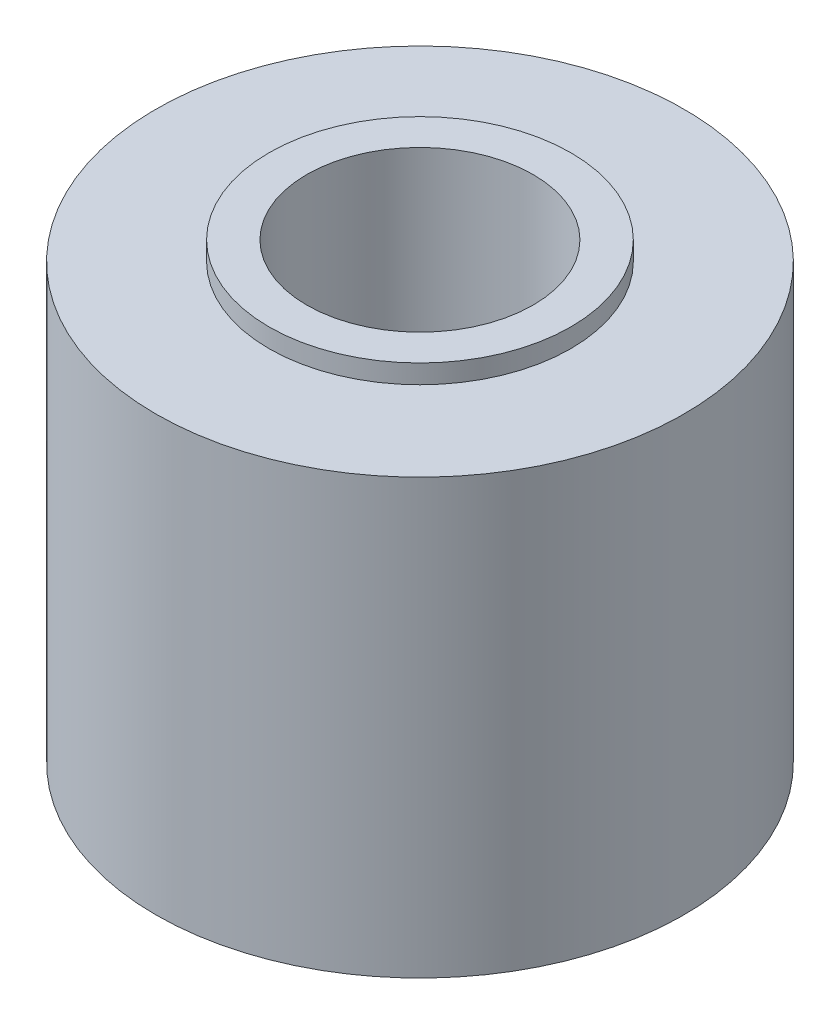
ISO-10303-21;
HEADER;
FILE_DESCRIPTION(('STEP AP214'),'2;1');
FILE_NAME('part.step','',(''),(''),'','','');
FILE_SCHEMA(('AUTOMOTIVE_DESIGN { 1 0 10303 214 1 1 1 1 }'));
ENDSEC;
DATA;
#1=APPLICATION_CONTEXT('core data for automotive mechanical design processes');
#2=APPLICATION_PROTOCOL_DEFINITION('international standard','automotive_design',2000,#1);
#3=PRODUCT_CONTEXT('',#1,'mechanical');
#4=PRODUCT('Part','Part','',(#3));
#5=PRODUCT_RELATED_PRODUCT_CATEGORY('part','',(#4));
#6=PRODUCT_DEFINITION_FORMATION('','',#4);
#7=PRODUCT_DEFINITION_CONTEXT('part definition',#1,'design');
#8=PRODUCT_DEFINITION('design','',#6,#7);
#9=PRODUCT_DEFINITION_SHAPE('','',#8);
#10=(LENGTH_UNIT() NAMED_UNIT(*) SI_UNIT(.MILLI.,.METRE.));
#11=(NAMED_UNIT(*) PLANE_ANGLE_UNIT() SI_UNIT($,.RADIAN.));
#12=(NAMED_UNIT(*) SI_UNIT($,.STERADIAN.) SOLID_ANGLE_UNIT());
#13=UNCERTAINTY_MEASURE_WITH_UNIT(LENGTH_MEASURE(1.E-05),#10,'distance_accuracy_value','');
#14=(GEOMETRIC_REPRESENTATION_CONTEXT(3) GLOBAL_UNCERTAINTY_ASSIGNED_CONTEXT((#13)) GLOBAL_UNIT_ASSIGNED_CONTEXT((#10,
#11,#12)) REPRESENTATION_CONTEXT('',''));
#15=CARTESIAN_POINT('',(0.,0.,0.));
#16=DIRECTION('',(0.,0.,1.));
#17=DIRECTION('',(1.,0.,0.));
#18=AXIS2_PLACEMENT_3D('',#15,#16,#17);
#19=CARTESIAN_POINT('',(0.,14.,0.));
#20=DIRECTION('',(0.,-1.,0.));
#21=DIRECTION('',(0.,0.,-1.));
#22=AXIS2_PLACEMENT_3D('',#19,#20,#21);
#23=CYLINDRICAL_SURFACE('',#22,7.);
#24=CARTESIAN_POINT('',(0.,2.,0.));
#25=DIRECTION('',(0.,1.,0.));
#26=DIRECTION('',(0.,0.,1.));
#27=AXIS2_PLACEMENT_3D('',#24,#25,#26);
#28=CIRCLE('',#27,7.);
#29=CARTESIAN_POINT('',(0.,2.,7.));
#30=VERTEX_POINT('',#29);
#31=EDGE_CURVE('E42',#30,#30,#28,.T.);
#32=ORIENTED_EDGE('',*,*,#31,.T.);
#33=EDGE_LOOP('',(#32));
#34=FACE_BOUND('',#33,.T.);
#35=CARTESIAN_POINT('',(0.,13.5,0.));
#36=DIRECTION('',(0.,1.,0.));
#37=DIRECTION('',(0.,0.,1.));
#38=AXIS2_PLACEMENT_3D('',#35,#36,#37);
#39=CIRCLE('',#38,7.);
#40=CARTESIAN_POINT('',(0.,13.5,7.));
#41=VERTEX_POINT('',#40);
#42=EDGE_CURVE('E54',#41,#41,#39,.T.);
#43=ORIENTED_EDGE('',*,*,#42,.F.);
#44=EDGE_LOOP('',(#43));
#45=FACE_BOUND('',#44,.T.);
#46=ADVANCED_FACE('F28',(#34,#45),#23,.T.);
#47=CARTESIAN_POINT('',(0.,14.,0.));
#48=DIRECTION('',(0.,1.,0.));
#49=DIRECTION('',(0.,0.,1.));
#50=AXIS2_PLACEMENT_3D('',#47,#48,#49);
#51=PLANE('',#50);
#52=CARTESIAN_POINT('',(0.,14.,0.));
#53=DIRECTION('',(0.,1.,0.));
#54=DIRECTION('',(0.,0.,1.));
#55=AXIS2_PLACEMENT_3D('',#52,#53,#54);
#56=CIRCLE('',#55,3.);
#57=CARTESIAN_POINT('',(0.,14.,3.));
#58=VERTEX_POINT('',#57);
#59=EDGE_CURVE('E10',#58,#58,#56,.T.);
#60=ORIENTED_EDGE('',*,*,#59,.F.);
#61=EDGE_LOOP('',(#60));
#62=FACE_BOUND('',#61,.T.);
#63=CARTESIAN_POINT('',(0.,14.,0.));
#64=DIRECTION('',(0.,1.,0.));
#65=DIRECTION('',(0.,0.,1.));
#66=AXIS2_PLACEMENT_3D('',#63,#64,#65);
#67=CIRCLE('',#66,4.);
#68=CARTESIAN_POINT('',(0.,14.,4.));
#69=VERTEX_POINT('',#68);
#70=EDGE_CURVE('E48',#69,#69,#67,.T.);
#71=ORIENTED_EDGE('',*,*,#70,.T.);
#72=EDGE_LOOP('',(#71));
#73=FACE_BOUND('',#72,.T.);
#74=ADVANCED_FACE('F62',(#62,#73),#51,.T.);
#75=CARTESIAN_POINT('',(0.,0.,0.));
#76=DIRECTION('',(0.,1.,0.));
#77=DIRECTION('',(0.,0.,1.));
#78=AXIS2_PLACEMENT_3D('',#75,#76,#77);
#79=PLANE('',#78);
#80=CARTESIAN_POINT('',(0.,0.,0.));
#81=DIRECTION('',(0.,1.,0.));
#82=DIRECTION('',(0.,0.,1.));
#83=AXIS2_PLACEMENT_3D('',#80,#81,#82);
#84=CIRCLE('',#83,3.);
#85=CARTESIAN_POINT('',(0.,0.,3.));
#86=VERTEX_POINT('',#85);
#87=EDGE_CURVE('E31',#86,#86,#84,.T.);
#88=ORIENTED_EDGE('',*,*,#87,.T.);
#89=EDGE_LOOP('',(#88));
#90=FACE_BOUND('',#89,.T.);
#91=CARTESIAN_POINT('',(0.,0.,0.));
#92=DIRECTION('',(0.,1.,0.));
#93=DIRECTION('',(0.,0.,1.));
#94=AXIS2_PLACEMENT_3D('',#91,#92,#93);
#95=CIRCLE('',#94,4.);
#96=CARTESIAN_POINT('',(0.,0.,4.));
#97=VERTEX_POINT('',#96);
#98=EDGE_CURVE('E45',#97,#97,#95,.T.);
#99=ORIENTED_EDGE('',*,*,#98,.F.);
#100=EDGE_LOOP('',(#99));
#101=FACE_BOUND('',#100,.T.);
#102=ADVANCED_FACE('F68',(#90,#101),#79,.F.);
#103=CARTESIAN_POINT('',(0.,14.,0.));
#104=DIRECTION('',(0.,-1.,0.));
#105=DIRECTION('',(0.,0.,-1.));
#106=AXIS2_PLACEMENT_3D('',#103,#104,#105);
#107=CYLINDRICAL_SURFACE('',#106,3.);
#108=ORIENTED_EDGE('',*,*,#59,.T.);
#109=EDGE_LOOP('',(#108));
#110=FACE_BOUND('',#109,.T.);
#111=ORIENTED_EDGE('',*,*,#87,.F.);
#112=EDGE_LOOP('',(#111));
#113=FACE_BOUND('',#112,.T.);
#114=ADVANCED_FACE('F85',(#110,#113),#107,.F.);
#115=CARTESIAN_POINT('',(0.,14.,0.));
#116=DIRECTION('',(0.,1.,0.));
#117=DIRECTION('',(0.,0.,1.));
#118=AXIS2_PLACEMENT_3D('',#115,#116,#117);
#119=CYLINDRICAL_SURFACE('',#118,4.);
#120=ORIENTED_EDGE('',*,*,#98,.T.);
#121=EDGE_LOOP('',(#120));
#122=FACE_BOUND('',#121,.T.);
#123=CARTESIAN_POINT('',(0.,2.,0.));
#124=DIRECTION('',(0.,1.,0.));
#125=DIRECTION('',(0.,0.,1.));
#126=AXIS2_PLACEMENT_3D('',#123,#124,#125);
#127=CIRCLE('',#126,4.);
#128=CARTESIAN_POINT('',(0.,2.,4.));
#129=VERTEX_POINT('',#128);
#130=EDGE_CURVE('E38',#129,#129,#127,.T.);
#131=ORIENTED_EDGE('',*,*,#130,.F.);
#132=EDGE_LOOP('',(#131));
#133=FACE_BOUND('',#132,.T.);
#134=ADVANCED_FACE('F76',(#122,#133),#119,.T.);
#135=CARTESIAN_POINT('',(4.,2.,0.));
#136=DIRECTION('',(0.,-1.,0.));
#137=DIRECTION('',(0.,0.,-1.));
#138=AXIS2_PLACEMENT_3D('',#135,#136,#137);
#139=PLANE('',#138);
#140=ORIENTED_EDGE('',*,*,#130,.T.);
#141=EDGE_LOOP('',(#140));
#142=FACE_BOUND('',#141,.T.);
#143=ORIENTED_EDGE('',*,*,#31,.F.);
#144=EDGE_LOOP('',(#143));
#145=FACE_BOUND('',#144,.T.);
#146=ADVANCED_FACE('F73',(#142,#145),#139,.T.);
#147=CARTESIAN_POINT('',(0.,14.,0.));
#148=DIRECTION('',(0.,1.,0.));
#149=DIRECTION('',(0.,0.,1.));
#150=AXIS2_PLACEMENT_3D('',#147,#148,#149);
#151=CYLINDRICAL_SURFACE('',#150,4.);
#152=CARTESIAN_POINT('',(0.,13.5,0.));
#153=DIRECTION('',(0.,1.,0.));
#154=DIRECTION('',(0.,0.,1.));
#155=AXIS2_PLACEMENT_3D('',#152,#153,#154);
#156=CIRCLE('',#155,4.);
#157=CARTESIAN_POINT('',(0.,13.5,4.));
#158=VERTEX_POINT('',#157);
#159=EDGE_CURVE('E51',#158,#158,#156,.T.);
#160=ORIENTED_EDGE('',*,*,#159,.T.);
#161=EDGE_LOOP('',(#160));
#162=FACE_BOUND('',#161,.T.);
#163=ORIENTED_EDGE('',*,*,#70,.F.);
#164=EDGE_LOOP('',(#163));
#165=FACE_BOUND('',#164,.T.);
#166=ADVANCED_FACE('F75',(#162,#165),#151,.T.);
#167=CARTESIAN_POINT('',(7.,13.5,0.));
#168=DIRECTION('',(0.,1.,0.));
#169=DIRECTION('',(0.,0.,1.));
#170=AXIS2_PLACEMENT_3D('',#167,#168,#169);
#171=PLANE('',#170);
#172=ORIENTED_EDGE('',*,*,#42,.T.);
#173=EDGE_LOOP('',(#172));
#174=FACE_BOUND('',#173,.T.);
#175=ORIENTED_EDGE('',*,*,#159,.F.);
#176=EDGE_LOOP('',(#175));
#177=FACE_BOUND('',#176,.T.);
#178=ADVANCED_FACE('F58',(#174,#177),#171,.T.);
#179=CLOSED_SHELL('',(#46,#74,#102,#114,#134,#146,#166,#178));
#180=MANIFOLD_SOLID_BREP('B2',#179);
#181=ADVANCED_BREP_SHAPE_REPRESENTATION('',(#18,#180),#14);
#182=SHAPE_DEFINITION_REPRESENTATION(#9,#181);
ENDSEC;
END-ISO-10303-21;
